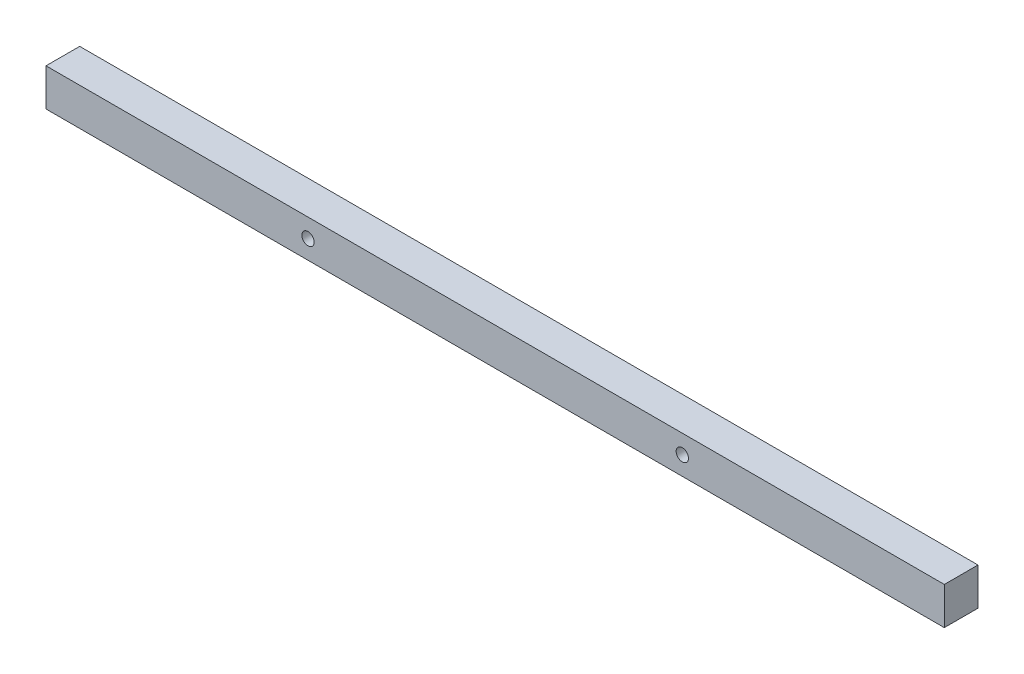
ISO-10303-21;
HEADER;
FILE_DESCRIPTION(('STEP AP214'),'2;1');
FILE_NAME('part.step','',(''),(''),'','','');
FILE_SCHEMA(('AUTOMOTIVE_DESIGN { 1 0 10303 214 1 1 1 1 }'));
ENDSEC;
DATA;
#1=APPLICATION_CONTEXT('core data for automotive mechanical design processes');
#2=APPLICATION_PROTOCOL_DEFINITION('international standard','automotive_design',2000,#1);
#3=PRODUCT_CONTEXT('',#1,'mechanical');
#4=PRODUCT('Part','Part','',(#3));
#5=PRODUCT_RELATED_PRODUCT_CATEGORY('part','',(#4));
#6=PRODUCT_DEFINITION_FORMATION('','',#4);
#7=PRODUCT_DEFINITION_CONTEXT('part definition',#1,'design');
#8=PRODUCT_DEFINITION('design','',#6,#7);
#9=PRODUCT_DEFINITION_SHAPE('','',#8);
#10=(LENGTH_UNIT() NAMED_UNIT(*) SI_UNIT(.MILLI.,.METRE.));
#11=(NAMED_UNIT(*) PLANE_ANGLE_UNIT() SI_UNIT($,.RADIAN.));
#12=(NAMED_UNIT(*) SI_UNIT($,.STERADIAN.) SOLID_ANGLE_UNIT());
#13=UNCERTAINTY_MEASURE_WITH_UNIT(LENGTH_MEASURE(1.E-05),#10,'distance_accuracy_value','');
#14=(GEOMETRIC_REPRESENTATION_CONTEXT(3) GLOBAL_UNCERTAINTY_ASSIGNED_CONTEXT((#13)) GLOBAL_UNIT_ASSIGNED_CONTEXT((#10,
#11,#12)) REPRESENTATION_CONTEXT('',''));
#15=CARTESIAN_POINT('',(0.,0.,0.));
#16=DIRECTION('',(0.,0.,1.));
#17=DIRECTION('',(1.,0.,0.));
#18=AXIS2_PLACEMENT_3D('',#15,#16,#17);
#19=CARTESIAN_POINT('',(0.,0.,9.));
#20=DIRECTION('',(0.,0.,1.));
#21=DIRECTION('',(1.,0.,0.));
#22=AXIS2_PLACEMENT_3D('',#19,#20,#21);
#23=PLANE('',#22);
#24=CARTESIAN_POINT('',(50.,0.,9.));
#25=DIRECTION('',(0.,0.,1.));
#26=DIRECTION('',(1.,0.,0.));
#27=AXIS2_PLACEMENT_3D('',#24,#25,#26);
#28=CIRCLE('',#27,1.65);
#29=CARTESIAN_POINT('',(51.65,0.,9.));
#30=VERTEX_POINT('',#29);
#31=EDGE_CURVE('E95',#30,#30,#28,.T.);
#32=ORIENTED_EDGE('',*,*,#31,.F.);
#33=EDGE_LOOP('',(#32));
#34=FACE_BOUND('',#33,.T.);
#35=CARTESIAN_POINT('',(-50.,0.,9.));
#36=DIRECTION('',(0.,0.,1.));
#37=DIRECTION('',(1.,0.,0.));
#38=AXIS2_PLACEMENT_3D('',#35,#36,#37);
#39=CIRCLE('',#38,1.65);
#40=CARTESIAN_POINT('',(-48.35,0.,9.));
#41=VERTEX_POINT('',#40);
#42=EDGE_CURVE('E74',#41,#41,#39,.T.);
#43=ORIENTED_EDGE('',*,*,#42,.F.);
#44=EDGE_LOOP('',(#43));
#45=FACE_BOUND('',#44,.T.);
#46=DIRECTION('',(-1.,0.,0.));
#47=VECTOR('',#46,1.);
#48=CARTESIAN_POINT('',(0.,-5.,9.));
#49=LINE('',#48,#47);
#50=CARTESIAN_POINT('',(120.,-5.,9.));
#51=VERTEX_POINT('',#50);
#52=CARTESIAN_POINT('',(-120.,-5.,9.));
#53=VERTEX_POINT('',#52);
#54=EDGE_CURVE('E10',#51,#53,#49,.T.);
#55=ORIENTED_EDGE('',*,*,#54,.F.);
#56=DIRECTION('',(0.,-1.,0.));
#57=VECTOR('',#56,1.);
#58=CARTESIAN_POINT('',(120.,0.,9.));
#59=LINE('',#58,#57);
#60=CARTESIAN_POINT('',(120.,5.,9.));
#61=VERTEX_POINT('',#60);
#62=EDGE_CURVE('E63',#61,#51,#59,.T.);
#63=ORIENTED_EDGE('',*,*,#62,.F.);
#64=DIRECTION('',(1.,0.,0.));
#65=VECTOR('',#64,1.);
#66=CARTESIAN_POINT('',(0.,5.,9.));
#67=LINE('',#66,#65);
#68=CARTESIAN_POINT('',(-120.,5.,9.));
#69=VERTEX_POINT('',#68);
#70=EDGE_CURVE('E91',#69,#61,#67,.T.);
#71=ORIENTED_EDGE('',*,*,#70,.F.);
#72=DIRECTION('',(0.,1.,0.));
#73=VECTOR('',#72,1.);
#74=CARTESIAN_POINT('',(-120.,0.,9.));
#75=LINE('',#74,#73);
#76=EDGE_CURVE('E25',#53,#69,#75,.T.);
#77=ORIENTED_EDGE('',*,*,#76,.F.);
#78=EDGE_LOOP('',(#55,#63,#71,#77));
#79=FACE_BOUND('',#78,.T.);
#80=ADVANCED_FACE('F16',(#34,#45,#79),#23,.T.);
#81=CARTESIAN_POINT('',(0.,-5.,0.));
#82=DIRECTION('',(0.,-1.,0.));
#83=DIRECTION('',(0.,0.,-1.));
#84=AXIS2_PLACEMENT_3D('',#81,#82,#83);
#85=PLANE('',#84);
#86=DIRECTION('',(0.,0.,1.));
#87=VECTOR('',#86,1.);
#88=CARTESIAN_POINT('',(120.,-5.,0.));
#89=LINE('',#88,#87);
#90=CARTESIAN_POINT('',(120.,-5.,0.));
#91=VERTEX_POINT('',#90);
#92=EDGE_CURVE('E56',#91,#51,#89,.T.);
#93=ORIENTED_EDGE('',*,*,#92,.T.);
#94=ORIENTED_EDGE('',*,*,#54,.T.);
#95=DIRECTION('',(0.,0.,1.));
#96=VECTOR('',#95,1.);
#97=CARTESIAN_POINT('',(-120.,-5.,0.));
#98=LINE('',#97,#96);
#99=CARTESIAN_POINT('',(-120.,-5.,0.));
#100=VERTEX_POINT('',#99);
#101=EDGE_CURVE('E69',#100,#53,#98,.T.);
#102=ORIENTED_EDGE('',*,*,#101,.F.);
#103=DIRECTION('',(1.,0.,0.));
#104=VECTOR('',#103,1.);
#105=CARTESIAN_POINT('',(0.,-5.,0.));
#106=LINE('',#105,#104);
#107=EDGE_CURVE('E67',#100,#91,#106,.T.);
#108=ORIENTED_EDGE('',*,*,#107,.T.);
#109=EDGE_LOOP('',(#93,#94,#102,#108));
#110=FACE_BOUND('',#109,.T.);
#111=ADVANCED_FACE('F68',(#110),#85,.T.);
#112=CARTESIAN_POINT('',(-120.,0.,0.));
#113=DIRECTION('',(-1.,0.,0.));
#114=DIRECTION('',(0.,0.,1.));
#115=AXIS2_PLACEMENT_3D('',#112,#113,#114);
#116=PLANE('',#115);
#117=ORIENTED_EDGE('',*,*,#101,.T.);
#118=ORIENTED_EDGE('',*,*,#76,.T.);
#119=DIRECTION('',(0.,0.,1.));
#120=VECTOR('',#119,1.);
#121=CARTESIAN_POINT('',(-120.,5.,0.));
#122=LINE('',#121,#120);
#123=CARTESIAN_POINT('',(-120.,5.,0.));
#124=VERTEX_POINT('',#123);
#125=EDGE_CURVE('E86',#124,#69,#122,.T.);
#126=ORIENTED_EDGE('',*,*,#125,.F.);
#127=DIRECTION('',(0.,-1.,0.));
#128=VECTOR('',#127,1.);
#129=CARTESIAN_POINT('',(-120.,0.,0.));
#130=LINE('',#129,#128);
#131=EDGE_CURVE('E73',#124,#100,#130,.T.);
#132=ORIENTED_EDGE('',*,*,#131,.T.);
#133=EDGE_LOOP('',(#117,#118,#126,#132));
#134=FACE_BOUND('',#133,.T.);
#135=ADVANCED_FACE('F118',(#134),#116,.T.);
#136=CARTESIAN_POINT('',(0.,5.,0.));
#137=DIRECTION('',(0.,1.,0.));
#138=DIRECTION('',(0.,0.,1.));
#139=AXIS2_PLACEMENT_3D('',#136,#137,#138);
#140=PLANE('',#139);
#141=ORIENTED_EDGE('',*,*,#125,.T.);
#142=ORIENTED_EDGE('',*,*,#70,.T.);
#143=DIRECTION('',(0.,0.,1.));
#144=VECTOR('',#143,1.);
#145=CARTESIAN_POINT('',(120.,5.,0.));
#146=LINE('',#145,#144);
#147=CARTESIAN_POINT('',(120.,5.,0.));
#148=VERTEX_POINT('',#147);
#149=EDGE_CURVE('E64',#148,#61,#146,.T.);
#150=ORIENTED_EDGE('',*,*,#149,.F.);
#151=DIRECTION('',(-1.,0.,0.));
#152=VECTOR('',#151,1.);
#153=CARTESIAN_POINT('',(0.,5.,0.));
#154=LINE('',#153,#152);
#155=EDGE_CURVE('E79',#148,#124,#154,.T.);
#156=ORIENTED_EDGE('',*,*,#155,.T.);
#157=EDGE_LOOP('',(#141,#142,#150,#156));
#158=FACE_BOUND('',#157,.T.);
#159=ADVANCED_FACE('F110',(#158),#140,.T.);
#160=CARTESIAN_POINT('',(0.,0.,0.));
#161=DIRECTION('',(0.,0.,-1.));
#162=DIRECTION('',(-1.,0.,0.));
#163=AXIS2_PLACEMENT_3D('',#160,#161,#162);
#164=PLANE('',#163);
#165=CARTESIAN_POINT('',(50.,0.,0.));
#166=DIRECTION('',(0.,0.,-1.));
#167=DIRECTION('',(-1.,0.,0.));
#168=AXIS2_PLACEMENT_3D('',#165,#166,#167);
#169=CIRCLE('',#168,1.65);
#170=CARTESIAN_POINT('',(48.35,0.,0.));
#171=VERTEX_POINT('',#170);
#172=EDGE_CURVE('E20',#171,#171,#169,.T.);
#173=ORIENTED_EDGE('',*,*,#172,.F.);
#174=EDGE_LOOP('',(#173));
#175=FACE_BOUND('',#174,.T.);
#176=CARTESIAN_POINT('',(-50.,0.,0.));
#177=DIRECTION('',(0.,0.,-1.));
#178=DIRECTION('',(-1.,0.,0.));
#179=AXIS2_PLACEMENT_3D('',#176,#177,#178);
#180=CIRCLE('',#179,1.65);
#181=CARTESIAN_POINT('',(-51.65,0.,0.));
#182=VERTEX_POINT('',#181);
#183=EDGE_CURVE('E93',#182,#182,#180,.T.);
#184=ORIENTED_EDGE('',*,*,#183,.F.);
#185=EDGE_LOOP('',(#184));
#186=FACE_BOUND('',#185,.T.);
#187=DIRECTION('',(0.,1.,0.));
#188=VECTOR('',#187,1.);
#189=CARTESIAN_POINT('',(120.,0.,0.));
#190=LINE('',#189,#188);
#191=EDGE_CURVE('E61',#91,#148,#190,.T.);
#192=ORIENTED_EDGE('',*,*,#191,.F.);
#193=ORIENTED_EDGE('',*,*,#107,.F.);
#194=ORIENTED_EDGE('',*,*,#131,.F.);
#195=ORIENTED_EDGE('',*,*,#155,.F.);
#196=EDGE_LOOP('',(#192,#193,#194,#195));
#197=FACE_BOUND('',#196,.T.);
#198=ADVANCED_FACE('F77',(#175,#186,#197),#164,.T.);
#199=CARTESIAN_POINT('',(120.,0.,0.));
#200=DIRECTION('',(1.,0.,0.));
#201=DIRECTION('',(0.,0.,-1.));
#202=AXIS2_PLACEMENT_3D('',#199,#200,#201);
#203=PLANE('',#202);
#204=ORIENTED_EDGE('',*,*,#191,.T.);
#205=ORIENTED_EDGE('',*,*,#149,.T.);
#206=ORIENTED_EDGE('',*,*,#62,.T.);
#207=ORIENTED_EDGE('',*,*,#92,.F.);
#208=EDGE_LOOP('',(#204,#205,#206,#207));
#209=FACE_BOUND('',#208,.T.);
#210=ADVANCED_FACE('F58',(#209),#203,.T.);
#211=CARTESIAN_POINT('',(-50.,0.,-0.3));
#212=DIRECTION('',(0.,0.,1.));
#213=DIRECTION('',(1.,0.,0.));
#214=AXIS2_PLACEMENT_3D('',#211,#212,#213);
#215=CYLINDRICAL_SURFACE('',#214,1.65);
#216=ORIENTED_EDGE('',*,*,#42,.T.);
#217=EDGE_LOOP('',(#216));
#218=FACE_BOUND('',#217,.T.);
#219=ORIENTED_EDGE('',*,*,#183,.T.);
#220=EDGE_LOOP('',(#219));
#221=FACE_BOUND('',#220,.T.);
#222=ADVANCED_FACE('F116',(#218,#221),#215,.F.);
#223=CARTESIAN_POINT('',(50.,0.,-0.3));
#224=DIRECTION('',(0.,0.,1.));
#225=DIRECTION('',(1.,0.,0.));
#226=AXIS2_PLACEMENT_3D('',#223,#224,#225);
#227=CYLINDRICAL_SURFACE('',#226,1.65);
#228=ORIENTED_EDGE('',*,*,#31,.T.);
#229=EDGE_LOOP('',(#228));
#230=FACE_BOUND('',#229,.T.);
#231=ORIENTED_EDGE('',*,*,#172,.T.);
#232=EDGE_LOOP('',(#231));
#233=FACE_BOUND('',#232,.T.);
#234=ADVANCED_FACE('F106',(#230,#233),#227,.F.);
#235=CLOSED_SHELL('',(#80,#111,#135,#159,#198,#210,#222,#234));
#236=MANIFOLD_SOLID_BREP('B1',#235);
#237=ADVANCED_BREP_SHAPE_REPRESENTATION('',(#18,#236),#14);
#238=SHAPE_DEFINITION_REPRESENTATION(#9,#237);
ENDSEC;
END-ISO-10303-21;
